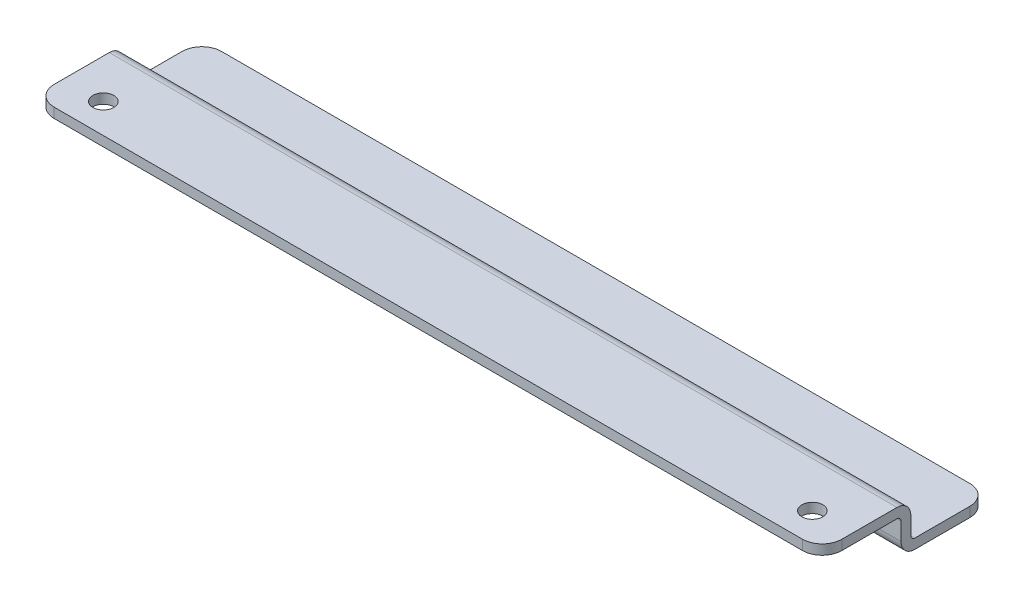
ISO-10303-21;
HEADER;
FILE_DESCRIPTION(('STEP AP214'),'2;1');
FILE_NAME('part.step','',(''),(''),'','','');
FILE_SCHEMA(('AUTOMOTIVE_DESIGN { 1 0 10303 214 1 1 1 1 }'));
ENDSEC;
DATA;
#1=APPLICATION_CONTEXT('core data for automotive mechanical design processes');
#2=APPLICATION_PROTOCOL_DEFINITION('international standard','automotive_design',2000,#1);
#3=PRODUCT_CONTEXT('',#1,'mechanical');
#4=PRODUCT('Part','Part','',(#3));
#5=PRODUCT_RELATED_PRODUCT_CATEGORY('part','',(#4));
#6=PRODUCT_DEFINITION_FORMATION('','',#4);
#7=PRODUCT_DEFINITION_CONTEXT('part definition',#1,'design');
#8=PRODUCT_DEFINITION('design','',#6,#7);
#9=PRODUCT_DEFINITION_SHAPE('','',#8);
#10=(LENGTH_UNIT() NAMED_UNIT(*) SI_UNIT(.MILLI.,.METRE.));
#11=(NAMED_UNIT(*) PLANE_ANGLE_UNIT() SI_UNIT($,.RADIAN.));
#12=(NAMED_UNIT(*) SI_UNIT($,.STERADIAN.) SOLID_ANGLE_UNIT());
#13=UNCERTAINTY_MEASURE_WITH_UNIT(LENGTH_MEASURE(1.E-05),#10,'distance_accuracy_value','');
#14=(GEOMETRIC_REPRESENTATION_CONTEXT(3) GLOBAL_UNCERTAINTY_ASSIGNED_CONTEXT((#13)) GLOBAL_UNIT_ASSIGNED_CONTEXT((#10,
#11,#12)) REPRESENTATION_CONTEXT('',''));
#15=CARTESIAN_POINT('',(0.,0.,0.));
#16=DIRECTION('',(0.,0.,1.));
#17=DIRECTION('',(1.,0.,0.));
#18=AXIS2_PLACEMENT_3D('',#15,#16,#17);
#19=CARTESIAN_POINT('',(254.,0.,0.));
#20=DIRECTION('',(0.,-1.,0.));
#21=DIRECTION('',(0.,0.,-1.));
#22=AXIS2_PLACEMENT_3D('',#19,#20,#21);
#23=PLANE('',#22);
#24=CARTESIAN_POINT('',(241.3,0.,-9.525));
#25=DIRECTION('',(0.,1.,0.));
#26=DIRECTION('',(0.,0.,1.));
#27=AXIS2_PLACEMENT_3D('',#24,#25,#26);
#28=CIRCLE('',#27,3.373501);
#29=CARTESIAN_POINT('',(241.3,0.,-6.151499));
#30=VERTEX_POINT('',#29);
#31=EDGE_CURVE('E499',#30,#30,#28,.T.);
#32=ORIENTED_EDGE('',*,*,#31,.F.);
#33=EDGE_LOOP('',(#32));
#34=FACE_BOUND('',#33,.T.);
#35=DIRECTION('',(0.,0.,1.));
#36=VECTOR('',#35,1.);
#37=CARTESIAN_POINT('',(0.,0.,0.));
#38=LINE('',#37,#36);
#39=CARTESIAN_POINT('',(0.,0.,-24.13));
#40=VERTEX_POINT('',#39);
#41=CARTESIAN_POINT('',(0.,0.,-6.35));
#42=VERTEX_POINT('',#41);
#43=EDGE_CURVE('E176',#40,#42,#38,.T.);
#44=ORIENTED_EDGE('',*,*,#43,.T.);
#45=CARTESIAN_POINT('',(6.34999999999999,0.,-6.35));
#46=DIRECTION('',(0.,-1.,0.));
#47=DIRECTION('',(0.,0.,-1.));
#48=AXIS2_PLACEMENT_3D('',#45,#46,#47);
#49=CIRCLE('',#48,6.35);
#50=CARTESIAN_POINT('',(6.34999999999999,0.,0.));
#51=VERTEX_POINT('',#50);
#52=EDGE_CURVE('E253',#42,#51,#49,.F.);
#53=ORIENTED_EDGE('',*,*,#52,.T.);
#54=DIRECTION('',(-1.,0.,0.));
#55=VECTOR('',#54,1.);
#56=CARTESIAN_POINT('',(254.,0.,0.));
#57=LINE('',#56,#55);
#58=CARTESIAN_POINT('',(247.65,0.,0.));
#59=VERTEX_POINT('',#58);
#60=EDGE_CURVE('E186',#59,#51,#57,.T.);
#61=ORIENTED_EDGE('',*,*,#60,.F.);
#62=CARTESIAN_POINT('',(247.65,0.,-6.35));
#63=DIRECTION('',(0.,-1.,0.));
#64=DIRECTION('',(0.,0.,-1.));
#65=AXIS2_PLACEMENT_3D('',#62,#63,#64);
#66=CIRCLE('',#65,6.35);
#67=CARTESIAN_POINT('',(254.,0.,-6.35));
#68=VERTEX_POINT('',#67);
#69=EDGE_CURVE('E48',#59,#68,#66,.F.);
#70=ORIENTED_EDGE('',*,*,#69,.T.);
#71=DIRECTION('',(0.,0.,1.));
#72=VECTOR('',#71,1.);
#73=CARTESIAN_POINT('',(254.,0.,0.));
#74=LINE('',#73,#72);
#75=CARTESIAN_POINT('',(254.,0.,-24.13));
#76=VERTEX_POINT('',#75);
#77=EDGE_CURVE('E190',#76,#68,#74,.T.);
#78=ORIENTED_EDGE('',*,*,#77,.F.);
#79=DIRECTION('',(-1.,0.,0.));
#80=VECTOR('',#79,1.);
#81=CARTESIAN_POINT('',(254.,0.,-24.13));
#82=LINE('',#81,#80);
#83=EDGE_CURVE('E222',#76,#40,#82,.T.);
#84=ORIENTED_EDGE('',*,*,#83,.T.);
#85=EDGE_LOOP('',(#44,#53,#61,#70,#78,#84));
#86=FACE_BOUND('',#85,.T.);
#87=CARTESIAN_POINT('',(12.7,0.,-9.525));
#88=DIRECTION('',(0.,1.,0.));
#89=DIRECTION('',(0.,0.,1.));
#90=AXIS2_PLACEMENT_3D('',#87,#88,#89);
#91=CIRCLE('',#90,3.37350099999999);
#92=CARTESIAN_POINT('',(12.7,0.,-6.15149900000001));
#93=VERTEX_POINT('',#92);
#94=EDGE_CURVE('E496',#93,#93,#91,.T.);
#95=ORIENTED_EDGE('',*,*,#94,.F.);
#96=EDGE_LOOP('',(#95));
#97=FACE_BOUND('',#96,.T.);
#98=ADVANCED_FACE('F33',(#34,#86,#97),#23,.F.);
#99=CARTESIAN_POINT('',(254.,-3.175,0.));
#100=DIRECTION('',(0.,0.,-1.));
#101=DIRECTION('',(-1.,0.,0.));
#102=AXIS2_PLACEMENT_3D('',#99,#100,#101);
#103=PLANE('',#102);
#104=ORIENTED_EDGE('',*,*,#60,.T.);
#105=DIRECTION('',(0.,-1.,0.));
#106=VECTOR('',#105,1.);
#107=CARTESIAN_POINT('',(6.34999999999999,-3.175,0.));
#108=LINE('',#107,#106);
#109=CARTESIAN_POINT('',(6.34999999999999,-3.175,0.));
#110=VERTEX_POINT('',#109);
#111=EDGE_CURVE('E246',#51,#110,#108,.T.);
#112=ORIENTED_EDGE('',*,*,#111,.T.);
#113=DIRECTION('',(-1.,0.,0.));
#114=VECTOR('',#113,1.);
#115=CARTESIAN_POINT('',(254.,-3.175,0.));
#116=LINE('',#115,#114);
#117=CARTESIAN_POINT('',(247.65,-3.175,0.));
#118=VERTEX_POINT('',#117);
#119=EDGE_CURVE('E171',#118,#110,#116,.T.);
#120=ORIENTED_EDGE('',*,*,#119,.F.);
#121=DIRECTION('',(0.,-1.,0.));
#122=VECTOR('',#121,1.);
#123=CARTESIAN_POINT('',(247.65,-3.175,0.));
#124=LINE('',#123,#122);
#125=EDGE_CURVE('E244',#118,#59,#124,.F.);
#126=ORIENTED_EDGE('',*,*,#125,.T.);
#127=EDGE_LOOP('',(#104,#112,#120,#126));
#128=FACE_BOUND('',#127,.T.);
#129=ADVANCED_FACE('F323',(#128),#103,.F.);
#130=CARTESIAN_POINT('',(254.,-3.175,-25.4));
#131=DIRECTION('',(0.,1.,0.));
#132=DIRECTION('',(0.,0.,1.));
#133=AXIS2_PLACEMENT_3D('',#130,#131,#132);
#134=PLANE('',#133);
#135=CARTESIAN_POINT('',(241.3,-3.175,-9.525));
#136=DIRECTION('',(0.,1.,0.));
#137=DIRECTION('',(0.,0.,1.));
#138=AXIS2_PLACEMENT_3D('',#135,#136,#137);
#139=CIRCLE('',#138,3.373501);
#140=CARTESIAN_POINT('',(241.3,-3.175,-6.151499));
#141=VERTEX_POINT('',#140);
#142=EDGE_CURVE('E497',#141,#141,#139,.T.);
#143=ORIENTED_EDGE('',*,*,#142,.T.);
#144=EDGE_LOOP('',(#143));
#145=FACE_BOUND('',#144,.T.);
#146=CARTESIAN_POINT('',(12.7,-3.175,-9.525));
#147=DIRECTION('',(0.,1.,0.));
#148=DIRECTION('',(0.,0.,1.));
#149=AXIS2_PLACEMENT_3D('',#146,#147,#148);
#150=CIRCLE('',#149,3.37350099999999);
#151=CARTESIAN_POINT('',(12.7,-3.175,-6.15149900000001));
#152=VERTEX_POINT('',#151);
#153=EDGE_CURVE('E269',#152,#152,#150,.T.);
#154=ORIENTED_EDGE('',*,*,#153,.T.);
#155=EDGE_LOOP('',(#154));
#156=FACE_BOUND('',#155,.T.);
#157=ORIENTED_EDGE('',*,*,#119,.T.);
#158=CARTESIAN_POINT('',(6.34999999999999,-3.175,-6.35));
#159=DIRECTION('',(0.,1.,0.));
#160=DIRECTION('',(0.,0.,1.));
#161=AXIS2_PLACEMENT_3D('',#158,#159,#160);
#162=CIRCLE('',#161,6.35);
#163=CARTESIAN_POINT('',(0.,-3.175,-6.35));
#164=VERTEX_POINT('',#163);
#165=EDGE_CURVE('E250',#110,#164,#162,.F.);
#166=ORIENTED_EDGE('',*,*,#165,.T.);
#167=DIRECTION('',(0.,0.,-1.));
#168=VECTOR('',#167,1.);
#169=CARTESIAN_POINT('',(0.,-3.175,-25.4));
#170=LINE('',#169,#168);
#171=CARTESIAN_POINT('',(0.,-3.175,-24.13));
#172=VERTEX_POINT('',#171);
#173=EDGE_CURVE('E277',#164,#172,#170,.T.);
#174=ORIENTED_EDGE('',*,*,#173,.T.);
#175=DIRECTION('',(-1.,0.,0.));
#176=VECTOR('',#175,1.);
#177=CARTESIAN_POINT('',(254.,-3.175,-24.13));
#178=LINE('',#177,#176);
#179=CARTESIAN_POINT('',(254.,-3.175,-24.13));
#180=VERTEX_POINT('',#179);
#181=EDGE_CURVE('E161',#172,#180,#178,.F.);
#182=ORIENTED_EDGE('',*,*,#181,.T.);
#183=DIRECTION('',(0.,0.,-1.));
#184=VECTOR('',#183,1.);
#185=CARTESIAN_POINT('',(254.,-3.175,-25.4));
#186=LINE('',#185,#184);
#187=CARTESIAN_POINT('',(254.,-3.175,-6.35));
#188=VERTEX_POINT('',#187);
#189=EDGE_CURVE('E180',#188,#180,#186,.T.);
#190=ORIENTED_EDGE('',*,*,#189,.F.);
#191=CARTESIAN_POINT('',(247.65,-3.175,-6.35));
#192=DIRECTION('',(0.,1.,0.));
#193=DIRECTION('',(0.,0.,1.));
#194=AXIS2_PLACEMENT_3D('',#191,#192,#193);
#195=CIRCLE('',#194,6.35);
#196=EDGE_CURVE('E56',#188,#118,#195,.F.);
#197=ORIENTED_EDGE('',*,*,#196,.T.);
#198=EDGE_LOOP('',(#157,#166,#174,#182,#190,#197));
#199=FACE_BOUND('',#198,.T.);
#200=ADVANCED_FACE('F259',(#145,#156,#199),#134,.F.);
#201=CARTESIAN_POINT('',(254.,-14.605,-25.4));
#202=DIRECTION('',(0.,0.,-1.));
#203=DIRECTION('',(-1.,0.,0.));
#204=AXIS2_PLACEMENT_3D('',#201,#202,#203);
#205=PLANE('',#204);
#206=DIRECTION('',(0.,-1.,0.));
#207=VECTOR('',#206,1.);
#208=CARTESIAN_POINT('',(0.,-14.605,-25.4));
#209=LINE('',#208,#207);
#210=CARTESIAN_POINT('',(0.,-4.445,-25.4));
#211=VERTEX_POINT('',#210);
#212=CARTESIAN_POINT('',(0.,-10.16,-25.4));
#213=VERTEX_POINT('',#212);
#214=EDGE_CURVE('E279',#211,#213,#209,.T.);
#215=ORIENTED_EDGE('',*,*,#214,.T.);
#216=DIRECTION('',(-1.,0.,0.));
#217=VECTOR('',#216,1.);
#218=CARTESIAN_POINT('',(254.,-10.16,-25.4));
#219=LINE('',#218,#217);
#220=CARTESIAN_POINT('',(254.,-10.16,-25.4));
#221=VERTEX_POINT('',#220);
#222=EDGE_CURVE('E216',#213,#221,#219,.F.);
#223=ORIENTED_EDGE('',*,*,#222,.T.);
#224=DIRECTION('',(0.,-1.,0.));
#225=VECTOR('',#224,1.);
#226=CARTESIAN_POINT('',(254.,-14.605,-25.4));
#227=LINE('',#226,#225);
#228=CARTESIAN_POINT('',(254.,-4.445,-25.4));
#229=VERTEX_POINT('',#228);
#230=EDGE_CURVE('E263',#229,#221,#227,.T.);
#231=ORIENTED_EDGE('',*,*,#230,.F.);
#232=DIRECTION('',(-1.,0.,0.));
#233=VECTOR('',#232,1.);
#234=CARTESIAN_POINT('',(0.,-4.445,-25.4));
#235=LINE('',#234,#233);
#236=EDGE_CURVE('E199',#229,#211,#235,.T.);
#237=ORIENTED_EDGE('',*,*,#236,.T.);
#238=EDGE_LOOP('',(#215,#223,#231,#237));
#239=FACE_BOUND('',#238,.T.);
#240=ADVANCED_FACE('F310',(#239),#205,.F.);
#241=CARTESIAN_POINT('',(254.,-14.605,-53.975));
#242=DIRECTION('',(0.,1.,0.));
#243=DIRECTION('',(0.,0.,1.));
#244=AXIS2_PLACEMENT_3D('',#241,#242,#243);
#245=PLANE('',#244);
#246=DIRECTION('',(0.,0.,-1.));
#247=VECTOR('',#246,1.);
#248=CARTESIAN_POINT('',(0.,-14.605,-53.975));
#249=LINE('',#248,#247);
#250=CARTESIAN_POINT('',(0.,-14.605,-29.845));
#251=VERTEX_POINT('',#250);
#252=CARTESIAN_POINT('',(0.,-14.605,-47.625));
#253=VERTEX_POINT('',#252);
#254=EDGE_CURVE('E182',#251,#253,#249,.T.);
#255=ORIENTED_EDGE('',*,*,#254,.T.);
#256=CARTESIAN_POINT('',(6.34999999999999,-14.605,-47.625));
#257=DIRECTION('',(0.,1.,0.));
#258=DIRECTION('',(0.,0.,1.));
#259=AXIS2_PLACEMENT_3D('',#256,#257,#258);
#260=CIRCLE('',#259,6.35);
#261=CARTESIAN_POINT('',(6.34999999999999,-14.605,-53.975));
#262=VERTEX_POINT('',#261);
#263=EDGE_CURVE('E242',#253,#262,#260,.F.);
#264=ORIENTED_EDGE('',*,*,#263,.T.);
#265=DIRECTION('',(-1.,0.,0.));
#266=VECTOR('',#265,1.);
#267=CARTESIAN_POINT('',(254.,-14.605,-53.975));
#268=LINE('',#267,#266);
#269=CARTESIAN_POINT('',(247.65,-14.605,-53.975));
#270=VERTEX_POINT('',#269);
#271=EDGE_CURVE('E193',#270,#262,#268,.T.);
#272=ORIENTED_EDGE('',*,*,#271,.F.);
#273=CARTESIAN_POINT('',(247.65,-14.605,-47.625));
#274=DIRECTION('',(0.,1.,0.));
#275=DIRECTION('',(0.,0.,1.));
#276=AXIS2_PLACEMENT_3D('',#273,#274,#275);
#277=CIRCLE('',#276,6.35);
#278=CARTESIAN_POINT('',(254.,-14.605,-47.625));
#279=VERTEX_POINT('',#278);
#280=EDGE_CURVE('E240',#270,#279,#277,.F.);
#281=ORIENTED_EDGE('',*,*,#280,.T.);
#282=DIRECTION('',(0.,0.,-1.));
#283=VECTOR('',#282,1.);
#284=CARTESIAN_POINT('',(254.,-14.605,-53.975));
#285=LINE('',#284,#283);
#286=CARTESIAN_POINT('',(254.,-14.605,-29.845));
#287=VERTEX_POINT('',#286);
#288=EDGE_CURVE('E266',#287,#279,#285,.T.);
#289=ORIENTED_EDGE('',*,*,#288,.F.);
#290=DIRECTION('',(-1.,0.,0.));
#291=VECTOR('',#290,1.);
#292=CARTESIAN_POINT('',(254.,-14.605,-29.845));
#293=LINE('',#292,#291);
#294=EDGE_CURVE('E210',#287,#251,#293,.T.);
#295=ORIENTED_EDGE('',*,*,#294,.T.);
#296=EDGE_LOOP('',(#255,#264,#272,#281,#289,#295));
#297=FACE_BOUND('',#296,.T.);
#298=ADVANCED_FACE('F285',(#297),#245,.F.);
#299=CARTESIAN_POINT('',(254.,-11.43,-53.975));
#300=DIRECTION('',(0.,0.,1.));
#301=DIRECTION('',(0.,-1.,0.));
#302=AXIS2_PLACEMENT_3D('',#299,#300,#301);
#303=PLANE('',#302);
#304=ORIENTED_EDGE('',*,*,#271,.T.);
#305=DIRECTION('',(0.,1.,0.));
#306=VECTOR('',#305,1.);
#307=CARTESIAN_POINT('',(6.34999999999999,-11.43,-53.975));
#308=LINE('',#307,#306);
#309=CARTESIAN_POINT('',(6.34999999999999,-11.43,-53.975));
#310=VERTEX_POINT('',#309);
#311=EDGE_CURVE('E229',#262,#310,#308,.T.);
#312=ORIENTED_EDGE('',*,*,#311,.T.);
#313=DIRECTION('',(-1.,0.,0.));
#314=VECTOR('',#313,1.);
#315=CARTESIAN_POINT('',(254.,-11.43,-53.975));
#316=LINE('',#315,#314);
#317=CARTESIAN_POINT('',(247.65,-11.43,-53.975));
#318=VERTEX_POINT('',#317);
#319=EDGE_CURVE('E189',#318,#310,#316,.T.);
#320=ORIENTED_EDGE('',*,*,#319,.F.);
#321=DIRECTION('',(0.,1.,0.));
#322=VECTOR('',#321,1.);
#323=CARTESIAN_POINT('',(247.65,-11.43,-53.975));
#324=LINE('',#323,#322);
#325=EDGE_CURVE('E227',#318,#270,#324,.F.);
#326=ORIENTED_EDGE('',*,*,#325,.T.);
#327=EDGE_LOOP('',(#304,#312,#320,#326));
#328=FACE_BOUND('',#327,.T.);
#329=ADVANCED_FACE('F295',(#328),#303,.F.);
#330=CARTESIAN_POINT('',(254.,-11.43,-28.575));
#331=DIRECTION('',(0.,-1.,0.));
#332=DIRECTION('',(0.,0.,-1.));
#333=AXIS2_PLACEMENT_3D('',#330,#331,#332);
#334=PLANE('',#333);
#335=ORIENTED_EDGE('',*,*,#319,.T.);
#336=CARTESIAN_POINT('',(6.34999999999999,-11.43,-47.625));
#337=DIRECTION('',(0.,-1.,0.));
#338=DIRECTION('',(0.,0.,-1.));
#339=AXIS2_PLACEMENT_3D('',#336,#337,#338);
#340=CIRCLE('',#339,6.35);
#341=CARTESIAN_POINT('',(0.,-11.43,-47.625));
#342=VERTEX_POINT('',#341);
#343=EDGE_CURVE('E234',#310,#342,#340,.F.);
#344=ORIENTED_EDGE('',*,*,#343,.T.);
#345=DIRECTION('',(0.,0.,1.));
#346=VECTOR('',#345,1.);
#347=CARTESIAN_POINT('',(0.,-11.43,-28.575));
#348=LINE('',#347,#346);
#349=CARTESIAN_POINT('',(0.,-11.43,-29.845));
#350=VERTEX_POINT('',#349);
#351=EDGE_CURVE('E177',#342,#350,#348,.T.);
#352=ORIENTED_EDGE('',*,*,#351,.T.);
#353=DIRECTION('',(-1.,0.,0.));
#354=VECTOR('',#353,1.);
#355=CARTESIAN_POINT('',(254.,-11.43,-29.845));
#356=LINE('',#355,#354);
#357=CARTESIAN_POINT('',(254.,-11.43,-29.845));
#358=VERTEX_POINT('',#357);
#359=EDGE_CURVE('E156',#350,#358,#356,.F.);
#360=ORIENTED_EDGE('',*,*,#359,.T.);
#361=DIRECTION('',(0.,0.,1.));
#362=VECTOR('',#361,1.);
#363=CARTESIAN_POINT('',(254.,-11.43,-28.575));
#364=LINE('',#363,#362);
#365=CARTESIAN_POINT('',(254.,-11.43,-47.625));
#366=VERTEX_POINT('',#365);
#367=EDGE_CURVE('E273',#366,#358,#364,.T.);
#368=ORIENTED_EDGE('',*,*,#367,.F.);
#369=CARTESIAN_POINT('',(247.65,-11.43,-47.625));
#370=DIRECTION('',(0.,-1.,0.));
#371=DIRECTION('',(0.,0.,-1.));
#372=AXIS2_PLACEMENT_3D('',#369,#370,#371);
#373=CIRCLE('',#372,6.35);
#374=EDGE_CURVE('E232',#366,#318,#373,.F.);
#375=ORIENTED_EDGE('',*,*,#374,.T.);
#376=EDGE_LOOP('',(#335,#344,#352,#360,#368,#375));
#377=FACE_BOUND('',#376,.T.);
#378=ADVANCED_FACE('F298',(#377),#334,.F.);
#379=CARTESIAN_POINT('',(254.,0.,-28.575));
#380=DIRECTION('',(0.,0.,1.));
#381=DIRECTION('',(1.,0.,0.));
#382=AXIS2_PLACEMENT_3D('',#379,#380,#381);
#383=PLANE('',#382);
#384=DIRECTION('',(0.,1.,0.));
#385=VECTOR('',#384,1.);
#386=CARTESIAN_POINT('',(0.,0.,-28.575));
#387=LINE('',#386,#385);
#388=CARTESIAN_POINT('',(0.,-10.16,-28.575));
#389=VERTEX_POINT('',#388);
#390=CARTESIAN_POINT('',(0.,-4.445,-28.575));
#391=VERTEX_POINT('',#390);
#392=EDGE_CURVE('E167',#389,#391,#387,.T.);
#393=ORIENTED_EDGE('',*,*,#392,.T.);
#394=DIRECTION('',(-1.,0.,0.));
#395=VECTOR('',#394,1.);
#396=CARTESIAN_POINT('',(254.,-4.445,-28.575));
#397=LINE('',#396,#395);
#398=CARTESIAN_POINT('',(254.,-4.445,-28.575));
#399=VERTEX_POINT('',#398);
#400=EDGE_CURVE('E225',#391,#399,#397,.F.);
#401=ORIENTED_EDGE('',*,*,#400,.T.);
#402=DIRECTION('',(0.,1.,0.));
#403=VECTOR('',#402,1.);
#404=CARTESIAN_POINT('',(254.,0.,-28.575));
#405=LINE('',#404,#403);
#406=CARTESIAN_POINT('',(254.,-10.16,-28.575));
#407=VERTEX_POINT('',#406);
#408=EDGE_CURVE('E170',#407,#399,#405,.T.);
#409=ORIENTED_EDGE('',*,*,#408,.F.);
#410=DIRECTION('',(-1.,0.,0.));
#411=VECTOR('',#410,1.);
#412=CARTESIAN_POINT('',(0.,-10.16,-28.575));
#413=LINE('',#412,#411);
#414=EDGE_CURVE('E154',#407,#389,#413,.T.);
#415=ORIENTED_EDGE('',*,*,#414,.T.);
#416=EDGE_LOOP('',(#393,#401,#409,#415));
#417=FACE_BOUND('',#416,.T.);
#418=ADVANCED_FACE('F166',(#417),#383,.F.);
#419=CARTESIAN_POINT('',(254.,0.,0.));
#420=DIRECTION('',(-1.,0.,0.));
#421=DIRECTION('',(0.,0.,1.));
#422=AXIS2_PLACEMENT_3D('',#419,#420,#421);
#423=PLANE('',#422);
#424=ORIENTED_EDGE('',*,*,#288,.T.);
#425=DIRECTION('',(0.,1.,0.));
#426=VECTOR('',#425,1.);
#427=CARTESIAN_POINT('',(254.,1.04083408558608E-13,-47.625));
#428=LINE('',#427,#426);
#429=EDGE_CURVE('E11',#279,#366,#428,.T.);
#430=ORIENTED_EDGE('',*,*,#429,.T.);
#431=ORIENTED_EDGE('',*,*,#367,.T.);
#432=CARTESIAN_POINT('',(254.,-10.16,-29.845));
#433=DIRECTION('',(-1.,0.,0.));
#434=DIRECTION('',(0.,0.,1.));
#435=AXIS2_PLACEMENT_3D('',#432,#433,#434);
#436=CIRCLE('',#435,1.27);
#437=EDGE_CURVE('E160',#358,#407,#436,.T.);
#438=ORIENTED_EDGE('',*,*,#437,.T.);
#439=ORIENTED_EDGE('',*,*,#408,.T.);
#440=CARTESIAN_POINT('',(254.,-4.445,-24.13));
#441=DIRECTION('',(-1.,0.,0.));
#442=DIRECTION('',(0.,0.,1.));
#443=AXIS2_PLACEMENT_3D('',#440,#441,#442);
#444=CIRCLE('',#443,4.445);
#445=EDGE_CURVE('E218',#399,#76,#444,.F.);
#446=ORIENTED_EDGE('',*,*,#445,.T.);
#447=ORIENTED_EDGE('',*,*,#77,.T.);
#448=DIRECTION('',(0.,-1.,0.));
#449=VECTOR('',#448,1.);
#450=CARTESIAN_POINT('',(254.,0.,-6.35));
#451=LINE('',#450,#449);
#452=EDGE_CURVE('E41',#68,#188,#451,.T.);
#453=ORIENTED_EDGE('',*,*,#452,.T.);
#454=ORIENTED_EDGE('',*,*,#189,.T.);
#455=CARTESIAN_POINT('',(254.,-4.445,-24.13));
#456=DIRECTION('',(-1.,0.,0.));
#457=DIRECTION('',(0.,0.,1.));
#458=AXIS2_PLACEMENT_3D('',#455,#456,#457);
#459=CIRCLE('',#458,1.27);
#460=EDGE_CURVE('E208',#180,#229,#459,.T.);
#461=ORIENTED_EDGE('',*,*,#460,.T.);
#462=ORIENTED_EDGE('',*,*,#230,.T.);
#463=CARTESIAN_POINT('',(254.,-10.16,-29.845));
#464=DIRECTION('',(-1.,0.,0.));
#465=DIRECTION('',(0.,0.,1.));
#466=AXIS2_PLACEMENT_3D('',#463,#464,#465);
#467=CIRCLE('',#466,4.445);
#468=EDGE_CURVE('E220',#221,#287,#467,.F.);
#469=ORIENTED_EDGE('',*,*,#468,.T.);
#470=EDGE_LOOP('',(#424,#430,#431,#438,#439,#446,#447,#453,#454,#461,#462,#469));
#471=FACE_BOUND('',#470,.T.);
#472=ADVANCED_FACE('F257',(#471),#423,.F.);
#473=CARTESIAN_POINT('',(0.,0.,0.));
#474=DIRECTION('',(-1.,0.,0.));
#475=DIRECTION('',(0.,0.,1.));
#476=AXIS2_PLACEMENT_3D('',#473,#474,#475);
#477=PLANE('',#476);
#478=ORIENTED_EDGE('',*,*,#351,.F.);
#479=DIRECTION('',(0.,1.,0.));
#480=VECTOR('',#479,1.);
#481=CARTESIAN_POINT('',(0.,-14.605,-47.625));
#482=LINE('',#481,#480);
#483=EDGE_CURVE('E238',#342,#253,#482,.F.);
#484=ORIENTED_EDGE('',*,*,#483,.T.);
#485=ORIENTED_EDGE('',*,*,#254,.F.);
#486=CARTESIAN_POINT('',(0.,-10.16,-29.845));
#487=DIRECTION('',(-1.,0.,0.));
#488=DIRECTION('',(0.,0.,1.));
#489=AXIS2_PLACEMENT_3D('',#486,#487,#488);
#490=CIRCLE('',#489,4.445);
#491=EDGE_CURVE('E214',#251,#213,#490,.T.);
#492=ORIENTED_EDGE('',*,*,#491,.T.);
#493=ORIENTED_EDGE('',*,*,#214,.F.);
#494=CARTESIAN_POINT('',(0.,-4.445,-24.13));
#495=DIRECTION('',(-1.,0.,0.));
#496=DIRECTION('',(0.,0.,1.));
#497=AXIS2_PLACEMENT_3D('',#494,#495,#496);
#498=CIRCLE('',#497,1.27);
#499=EDGE_CURVE('E205',#211,#172,#498,.F.);
#500=ORIENTED_EDGE('',*,*,#499,.T.);
#501=ORIENTED_EDGE('',*,*,#173,.F.);
#502=DIRECTION('',(0.,-1.,0.));
#503=VECTOR('',#502,1.);
#504=CARTESIAN_POINT('',(0.,0.,-6.35));
#505=LINE('',#504,#503);
#506=EDGE_CURVE('E236',#164,#42,#505,.F.);
#507=ORIENTED_EDGE('',*,*,#506,.T.);
#508=ORIENTED_EDGE('',*,*,#43,.F.);
#509=CARTESIAN_POINT('',(0.,-4.445,-24.13));
#510=DIRECTION('',(-1.,0.,0.));
#511=DIRECTION('',(0.,0.,1.));
#512=AXIS2_PLACEMENT_3D('',#509,#510,#511);
#513=CIRCLE('',#512,4.445);
#514=EDGE_CURVE('E175',#40,#391,#513,.T.);
#515=ORIENTED_EDGE('',*,*,#514,.T.);
#516=ORIENTED_EDGE('',*,*,#392,.F.);
#517=CARTESIAN_POINT('',(0.,-10.16,-29.845));
#518=DIRECTION('',(-1.,0.,0.));
#519=DIRECTION('',(0.,0.,1.));
#520=AXIS2_PLACEMENT_3D('',#517,#518,#519);
#521=CIRCLE('',#520,1.27);
#522=EDGE_CURVE('E150',#389,#350,#521,.F.);
#523=ORIENTED_EDGE('',*,*,#522,.T.);
#524=EDGE_LOOP('',(#478,#484,#485,#492,#493,#500,#501,#507,#508,#515,#516,#523));
#525=FACE_BOUND('',#524,.T.);
#526=ADVANCED_FACE('F173',(#525),#477,.T.);
#527=CARTESIAN_POINT('',(254.,-10.16,-29.845));
#528=DIRECTION('',(1.,0.,0.));
#529=DIRECTION('',(0.,0.,-1.));
#530=AXIS2_PLACEMENT_3D('',#527,#528,#529);
#531=CYLINDRICAL_SURFACE('',#530,1.27);
#532=ORIENTED_EDGE('',*,*,#437,.F.);
#533=ORIENTED_EDGE('',*,*,#359,.F.);
#534=ORIENTED_EDGE('',*,*,#522,.F.);
#535=ORIENTED_EDGE('',*,*,#414,.F.);
#536=EDGE_LOOP('',(#532,#533,#534,#535));
#537=FACE_BOUND('',#536,.T.);
#538=ADVANCED_FACE('F153',(#537),#531,.F.);
#539=CARTESIAN_POINT('',(254.,-4.445,-24.13));
#540=DIRECTION('',(1.,0.,0.));
#541=DIRECTION('',(0.,0.,-1.));
#542=AXIS2_PLACEMENT_3D('',#539,#540,#541);
#543=CYLINDRICAL_SURFACE('',#542,1.27);
#544=ORIENTED_EDGE('',*,*,#460,.F.);
#545=ORIENTED_EDGE('',*,*,#181,.F.);
#546=ORIENTED_EDGE('',*,*,#499,.F.);
#547=ORIENTED_EDGE('',*,*,#236,.F.);
#548=EDGE_LOOP('',(#544,#545,#546,#547));
#549=FACE_BOUND('',#548,.T.);
#550=ADVANCED_FACE('F314',(#549),#543,.F.);
#551=CARTESIAN_POINT('',(254.,-10.16,-29.845));
#552=DIRECTION('',(-1.,0.,0.));
#553=DIRECTION('',(0.,0.,1.));
#554=AXIS2_PLACEMENT_3D('',#551,#552,#553);
#555=CYLINDRICAL_SURFACE('',#554,4.445);
#556=ORIENTED_EDGE('',*,*,#468,.F.);
#557=ORIENTED_EDGE('',*,*,#222,.F.);
#558=ORIENTED_EDGE('',*,*,#491,.F.);
#559=ORIENTED_EDGE('',*,*,#294,.F.);
#560=EDGE_LOOP('',(#556,#557,#558,#559));
#561=FACE_BOUND('',#560,.T.);
#562=ADVANCED_FACE('F306',(#561),#555,.T.);
#563=CARTESIAN_POINT('',(254.,-4.445,-24.13));
#564=DIRECTION('',(-1.,0.,0.));
#565=DIRECTION('',(0.,0.,1.));
#566=AXIS2_PLACEMENT_3D('',#563,#564,#565);
#567=CYLINDRICAL_SURFACE('',#566,4.445);
#568=ORIENTED_EDGE('',*,*,#445,.F.);
#569=ORIENTED_EDGE('',*,*,#400,.F.);
#570=ORIENTED_EDGE('',*,*,#514,.F.);
#571=ORIENTED_EDGE('',*,*,#83,.F.);
#572=EDGE_LOOP('',(#568,#569,#570,#571));
#573=FACE_BOUND('',#572,.T.);
#574=ADVANCED_FACE('F359',(#573),#567,.T.);
#575=CARTESIAN_POINT('',(12.7,0.,-9.525));
#576=DIRECTION('',(0.,1.,0.));
#577=DIRECTION('',(0.,0.,1.));
#578=AXIS2_PLACEMENT_3D('',#575,#576,#577);
#579=CYLINDRICAL_SURFACE('',#578,3.37350099999999);
#580=ORIENTED_EDGE('',*,*,#153,.F.);
#581=EDGE_LOOP('',(#580));
#582=FACE_BOUND('',#581,.T.);
#583=ORIENTED_EDGE('',*,*,#94,.T.);
#584=EDGE_LOOP('',(#583));
#585=FACE_BOUND('',#584,.T.);
#586=ADVANCED_FACE('F362',(#582,#585),#579,.F.);
#587=CARTESIAN_POINT('',(241.3,0.,-9.525));
#588=DIRECTION('',(0.,1.,0.));
#589=DIRECTION('',(0.,0.,1.));
#590=AXIS2_PLACEMENT_3D('',#587,#588,#589);
#591=CYLINDRICAL_SURFACE('',#590,3.373501);
#592=ORIENTED_EDGE('',*,*,#142,.F.);
#593=EDGE_LOOP('',(#592));
#594=FACE_BOUND('',#593,.T.);
#595=ORIENTED_EDGE('',*,*,#31,.T.);
#596=EDGE_LOOP('',(#595));
#597=FACE_BOUND('',#596,.T.);
#598=ADVANCED_FACE('F366',(#594,#597),#591,.F.);
#599=CARTESIAN_POINT('',(6.34999999999999,-11.43,-47.625));
#600=DIRECTION('',(0.,-1.,0.));
#601=DIRECTION('',(0.,0.,-1.));
#602=AXIS2_PLACEMENT_3D('',#599,#600,#601);
#603=CYLINDRICAL_SURFACE('',#602,6.35);
#604=ORIENTED_EDGE('',*,*,#263,.F.);
#605=ORIENTED_EDGE('',*,*,#483,.F.);
#606=ORIENTED_EDGE('',*,*,#343,.F.);
#607=ORIENTED_EDGE('',*,*,#311,.F.);
#608=EDGE_LOOP('',(#604,#605,#606,#607));
#609=FACE_BOUND('',#608,.T.);
#610=ADVANCED_FACE('F292',(#609),#603,.T.);
#611=CARTESIAN_POINT('',(6.34999999999999,-3.175,-6.35));
#612=DIRECTION('',(0.,1.,0.));
#613=DIRECTION('',(0.,0.,1.));
#614=AXIS2_PLACEMENT_3D('',#611,#612,#613);
#615=CYLINDRICAL_SURFACE('',#614,6.35);
#616=ORIENTED_EDGE('',*,*,#52,.F.);
#617=ORIENTED_EDGE('',*,*,#506,.F.);
#618=ORIENTED_EDGE('',*,*,#165,.F.);
#619=ORIENTED_EDGE('',*,*,#111,.F.);
#620=EDGE_LOOP('',(#616,#617,#618,#619));
#621=FACE_BOUND('',#620,.T.);
#622=ADVANCED_FACE('F319',(#621),#615,.T.);
#623=CARTESIAN_POINT('',(247.65,1.04083408558608E-13,-47.625));
#624=DIRECTION('',(0.,1.,0.));
#625=DIRECTION('',(0.,0.,1.));
#626=AXIS2_PLACEMENT_3D('',#623,#624,#625);
#627=CYLINDRICAL_SURFACE('',#626,6.35);
#628=ORIENTED_EDGE('',*,*,#280,.F.);
#629=ORIENTED_EDGE('',*,*,#325,.F.);
#630=ORIENTED_EDGE('',*,*,#374,.F.);
#631=ORIENTED_EDGE('',*,*,#429,.F.);
#632=EDGE_LOOP('',(#628,#629,#630,#631));
#633=FACE_BOUND('',#632,.T.);
#634=ADVANCED_FACE('F303',(#633),#627,.T.);
#635=CARTESIAN_POINT('',(247.65,0.,-6.35));
#636=DIRECTION('',(0.,-1.,0.));
#637=DIRECTION('',(0.,0.,-1.));
#638=AXIS2_PLACEMENT_3D('',#635,#636,#637);
#639=CYLINDRICAL_SURFACE('',#638,6.35);
#640=ORIENTED_EDGE('',*,*,#69,.F.);
#641=ORIENTED_EDGE('',*,*,#125,.F.);
#642=ORIENTED_EDGE('',*,*,#196,.F.);
#643=ORIENTED_EDGE('',*,*,#452,.F.);
#644=EDGE_LOOP('',(#640,#641,#642,#643));
#645=FACE_BOUND('',#644,.T.);
#646=ADVANCED_FACE('F35',(#645),#639,.T.);
#647=CLOSED_SHELL('',(#98,#129,#200,#240,#298,#329,#378,#418,#472,#526,#538,#550,#562,#574,#586,
#598,#610,#622,#634,#646));
#648=MANIFOLD_SOLID_BREP('B2',#647);
#649=ADVANCED_BREP_SHAPE_REPRESENTATION('',(#18,#648),#14);
#650=SHAPE_DEFINITION_REPRESENTATION(#9,#649);
ENDSEC;
END-ISO-10303-21;
